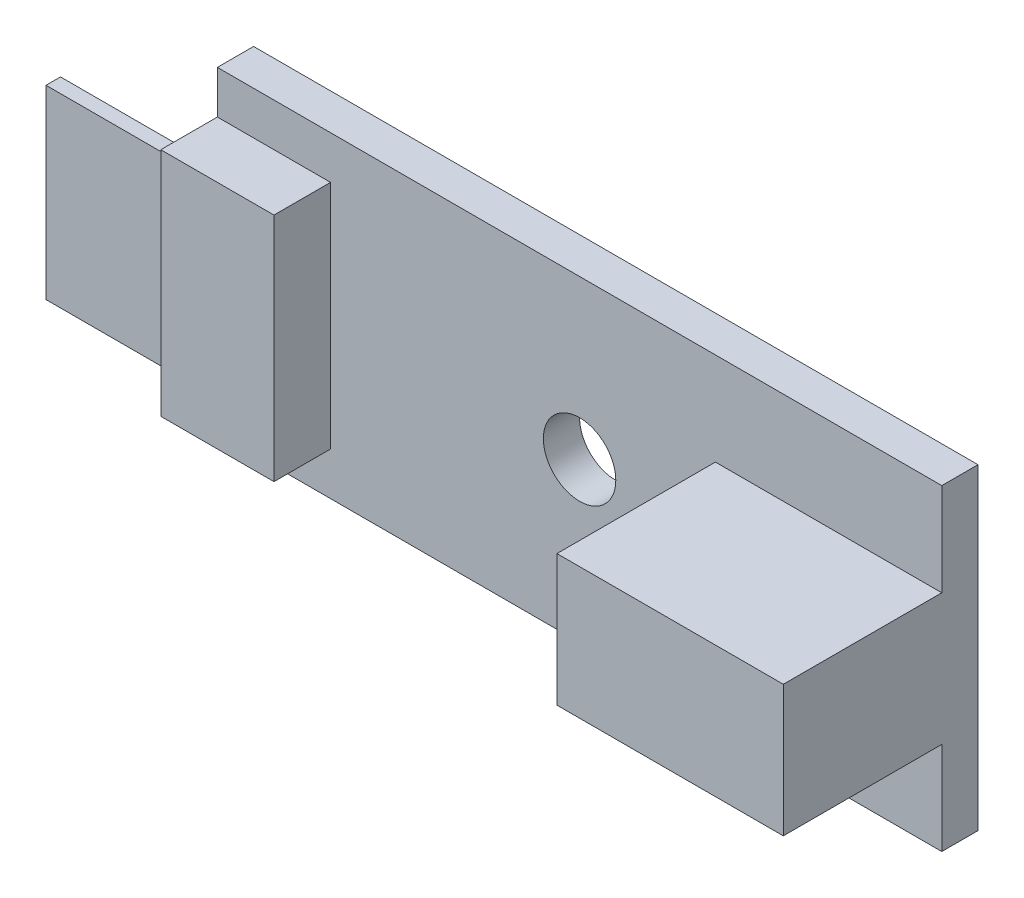
ISO-10303-21;
HEADER;
FILE_DESCRIPTION(('STEP AP214'),'2;1');
FILE_NAME('part.step','',(''),(''),'','','');
FILE_SCHEMA(('AUTOMOTIVE_DESIGN { 1 0 10303 214 1 1 1 1 }'));
ENDSEC;
DATA;
#1=APPLICATION_CONTEXT('core data for automotive mechanical design processes');
#2=APPLICATION_PROTOCOL_DEFINITION('international standard','automotive_design',2000,#1);
#3=PRODUCT_CONTEXT('',#1,'mechanical');
#4=PRODUCT('Part','Part','',(#3));
#5=PRODUCT_RELATED_PRODUCT_CATEGORY('part','',(#4));
#6=PRODUCT_DEFINITION_FORMATION('','',#4);
#7=PRODUCT_DEFINITION_CONTEXT('part definition',#1,'design');
#8=PRODUCT_DEFINITION('design','',#6,#7);
#9=PRODUCT_DEFINITION_SHAPE('','',#8);
#10=(LENGTH_UNIT() NAMED_UNIT(*) SI_UNIT(.MILLI.,.METRE.));
#11=(NAMED_UNIT(*) PLANE_ANGLE_UNIT() SI_UNIT($,.RADIAN.));
#12=(NAMED_UNIT(*) SI_UNIT($,.STERADIAN.) SOLID_ANGLE_UNIT());
#13=UNCERTAINTY_MEASURE_WITH_UNIT(LENGTH_MEASURE(1.E-05),#10,'distance_accuracy_value','');
#14=(GEOMETRIC_REPRESENTATION_CONTEXT(3) GLOBAL_UNCERTAINTY_ASSIGNED_CONTEXT((#13)) GLOBAL_UNIT_ASSIGNED_CONTEXT((#10,
#11,#12)) REPRESENTATION_CONTEXT('',''));
#15=CARTESIAN_POINT('',(0.,0.,0.));
#16=DIRECTION('',(0.,0.,1.));
#17=DIRECTION('',(1.,0.,0.));
#18=AXIS2_PLACEMENT_3D('',#15,#16,#17);
#19=CARTESIAN_POINT('',(6.,-2.9,7.));
#20=DIRECTION('',(0.,0.,1.));
#21=DIRECTION('',(1.,0.,0.));
#22=AXIS2_PLACEMENT_3D('',#19,#20,#21);
#23=PLANE('',#22);
#24=DIRECTION('',(0.,1.,0.));
#25=VECTOR('',#24,1.);
#26=CARTESIAN_POINT('',(6.,-2.9,7.));
#27=LINE('',#26,#25);
#28=CARTESIAN_POINT('',(6.,-2.9,7.));
#29=VERTEX_POINT('',#28);
#30=CARTESIAN_POINT('',(6.,2.9,7.));
#31=VERTEX_POINT('',#30);
#32=EDGE_CURVE('E135',#29,#31,#27,.T.);
#33=ORIENTED_EDGE('',*,*,#32,.F.);
#34=DIRECTION('',(1.,0.,0.));
#35=VECTOR('',#34,1.);
#36=CARTESIAN_POINT('',(6.,-2.9,7.));
#37=LINE('',#36,#35);
#38=CARTESIAN_POINT('',(16.,-2.9,7.));
#39=VERTEX_POINT('',#38);
#40=EDGE_CURVE('E11',#29,#39,#37,.T.);
#41=ORIENTED_EDGE('',*,*,#40,.T.);
#42=DIRECTION('',(0.,1.,0.));
#43=VECTOR('',#42,1.);
#44=CARTESIAN_POINT('',(16.,-2.9,7.));
#45=LINE('',#44,#43);
#46=CARTESIAN_POINT('',(16.,2.9,7.));
#47=VERTEX_POINT('',#46);
#48=EDGE_CURVE('E133',#39,#47,#45,.T.);
#49=ORIENTED_EDGE('',*,*,#48,.T.);
#50=DIRECTION('',(1.,0.,0.));
#51=VECTOR('',#50,1.);
#52=CARTESIAN_POINT('',(6.,2.9,7.));
#53=LINE('',#52,#51);
#54=EDGE_CURVE('E163',#31,#47,#53,.T.);
#55=ORIENTED_EDGE('',*,*,#54,.F.);
#56=EDGE_LOOP('',(#33,#41,#49,#55));
#57=FACE_BOUND('',#56,.T.);
#58=ADVANCED_FACE('F17',(#57),#23,.T.);
#59=CARTESIAN_POINT('',(-22.,-4.1,0.93));
#60=DIRECTION('',(1.,0.,0.));
#61=DIRECTION('',(0.,1.,0.));
#62=AXIS2_PLACEMENT_3D('',#59,#60,#61);
#63=PLANE('',#62);
#64=DIRECTION('',(0.,1.,0.));
#65=VECTOR('',#64,1.);
#66=CARTESIAN_POINT('',(-22.,-4.1,1.57));
#67=LINE('',#66,#65);
#68=CARTESIAN_POINT('',(-22.,-4.1,1.57));
#69=VERTEX_POINT('',#68);
#70=CARTESIAN_POINT('',(-22.,4.1,1.57));
#71=VERTEX_POINT('',#70);
#72=EDGE_CURVE('E155',#69,#71,#67,.T.);
#73=ORIENTED_EDGE('',*,*,#72,.T.);
#74=DIRECTION('',(0.,0.,1.));
#75=VECTOR('',#74,1.);
#76=CARTESIAN_POINT('',(-22.,4.1,0.93));
#77=LINE('',#76,#75);
#78=CARTESIAN_POINT('',(-22.,4.1,0.93));
#79=VERTEX_POINT('',#78);
#80=EDGE_CURVE('E240',#79,#71,#77,.T.);
#81=ORIENTED_EDGE('',*,*,#80,.F.);
#82=DIRECTION('',(0.,1.,0.));
#83=VECTOR('',#82,1.);
#84=CARTESIAN_POINT('',(-22.,-4.1,0.93));
#85=LINE('',#84,#83);
#86=CARTESIAN_POINT('',(-22.,-4.1,0.93));
#87=VERTEX_POINT('',#86);
#88=EDGE_CURVE('E244',#87,#79,#85,.T.);
#89=ORIENTED_EDGE('',*,*,#88,.F.);
#90=DIRECTION('',(0.,0.,1.));
#91=VECTOR('',#90,1.);
#92=CARTESIAN_POINT('',(-22.,-4.1,0.93));
#93=LINE('',#92,#91);
#94=EDGE_CURVE('E232',#87,#69,#93,.T.);
#95=ORIENTED_EDGE('',*,*,#94,.T.);
#96=EDGE_LOOP('',(#73,#81,#89,#95));
#97=FACE_BOUND('',#96,.T.);
#98=ADVANCED_FACE('F254',(#97),#63,.F.);
#99=CARTESIAN_POINT('',(0.,0.,-2.4));
#100=DIRECTION('',(0.,0.,1.));
#101=DIRECTION('',(1.,0.,0.));
#102=AXIS2_PLACEMENT_3D('',#99,#100,#101);
#103=CYLINDRICAL_SURFACE('',#102,1.6);
#104=CARTESIAN_POINT('',(0.,0.,0.));
#105=DIRECTION('',(0.,0.,1.));
#106=DIRECTION('',(1.,0.,0.));
#107=AXIS2_PLACEMENT_3D('',#104,#105,#106);
#108=CIRCLE('',#107,1.6);
#109=CARTESIAN_POINT('',(1.6,0.,0.));
#110=VERTEX_POINT('',#109);
#111=EDGE_CURVE('E194',#110,#110,#108,.T.);
#112=ORIENTED_EDGE('',*,*,#111,.T.);
#113=EDGE_LOOP('',(#112));
#114=FACE_BOUND('',#113,.T.);
#115=CARTESIAN_POINT('',(0.,0.,-1.6));
#116=DIRECTION('',(0.,0.,1.));
#117=DIRECTION('',(1.,0.,0.));
#118=AXIS2_PLACEMENT_3D('',#115,#116,#117);
#119=CIRCLE('',#118,1.6);
#120=CARTESIAN_POINT('',(1.6,0.,-1.6));
#121=VERTEX_POINT('',#120);
#122=EDGE_CURVE('E206',#121,#121,#119,.T.);
#123=ORIENTED_EDGE('',*,*,#122,.F.);
#124=EDGE_LOOP('',(#123));
#125=FACE_BOUND('',#124,.T.);
#126=ADVANCED_FACE('F409',(#114,#125),#103,.F.);
#127=CARTESIAN_POINT('',(-11.,-5.1,0.));
#128=DIRECTION('',(1.,0.,0.));
#129=DIRECTION('',(0.,1.,0.));
#130=AXIS2_PLACEMENT_3D('',#127,#128,#129);
#131=PLANE('',#130);
#132=DIRECTION('',(0.,0.,1.));
#133=VECTOR('',#132,1.);
#134=CARTESIAN_POINT('',(-11.,-5.1,0.));
#135=LINE('',#134,#133);
#136=CARTESIAN_POINT('',(-11.,-5.1,0.));
#137=VERTEX_POINT('',#136);
#138=CARTESIAN_POINT('',(-11.,-5.1,2.5));
#139=VERTEX_POINT('',#138);
#140=EDGE_CURVE('E210',#137,#139,#135,.T.);
#141=ORIENTED_EDGE('',*,*,#140,.F.);
#142=DIRECTION('',(0.,1.,0.));
#143=VECTOR('',#142,1.);
#144=CARTESIAN_POINT('',(-11.,-5.1,0.));
#145=LINE('',#144,#143);
#146=CARTESIAN_POINT('',(-11.,5.1,0.));
#147=VERTEX_POINT('',#146);
#148=EDGE_CURVE('E278',#137,#147,#145,.T.);
#149=ORIENTED_EDGE('',*,*,#148,.T.);
#150=DIRECTION('',(0.,0.,1.));
#151=VECTOR('',#150,1.);
#152=CARTESIAN_POINT('',(-11.,5.1,0.));
#153=LINE('',#152,#151);
#154=CARTESIAN_POINT('',(-11.,5.1,2.5));
#155=VERTEX_POINT('',#154);
#156=EDGE_CURVE('E226',#147,#155,#153,.T.);
#157=ORIENTED_EDGE('',*,*,#156,.T.);
#158=DIRECTION('',(0.,1.,0.));
#159=VECTOR('',#158,1.);
#160=CARTESIAN_POINT('',(-11.,-5.1,2.5));
#161=LINE('',#160,#159);
#162=EDGE_CURVE('E221',#139,#155,#161,.T.);
#163=ORIENTED_EDGE('',*,*,#162,.F.);
#164=EDGE_LOOP('',(#141,#149,#157,#163));
#165=FACE_BOUND('',#164,.T.);
#166=ADVANCED_FACE('F416',(#165),#131,.T.);
#167=CARTESIAN_POINT('',(6.,-2.9,0.));
#168=DIRECTION('',(0.,1.,0.));
#169=DIRECTION('',(1.,0.,0.));
#170=AXIS2_PLACEMENT_3D('',#167,#168,#169);
#171=PLANE('',#170);
#172=DIRECTION('',(0.,0.,1.));
#173=VECTOR('',#172,1.);
#174=CARTESIAN_POINT('',(16.,-2.9,0.));
#175=LINE('',#174,#173);
#176=CARTESIAN_POINT('',(16.,-2.9,0.));
#177=VERTEX_POINT('',#176);
#178=EDGE_CURVE('E137',#177,#39,#175,.T.);
#179=ORIENTED_EDGE('',*,*,#178,.T.);
#180=ORIENTED_EDGE('',*,*,#40,.F.);
#181=DIRECTION('',(0.,0.,1.));
#182=VECTOR('',#181,1.);
#183=CARTESIAN_POINT('',(6.,-2.9,0.));
#184=LINE('',#183,#182);
#185=CARTESIAN_POINT('',(6.,-2.9,0.));
#186=VERTEX_POINT('',#185);
#187=EDGE_CURVE('E26',#186,#29,#184,.T.);
#188=ORIENTED_EDGE('',*,*,#187,.F.);
#189=DIRECTION('',(1.,0.,0.));
#190=VECTOR('',#189,1.);
#191=CARTESIAN_POINT('',(6.,-2.9,0.));
#192=LINE('',#191,#190);
#193=EDGE_CURVE('E140',#186,#177,#192,.T.);
#194=ORIENTED_EDGE('',*,*,#193,.T.);
#195=EDGE_LOOP('',(#179,#180,#188,#194));
#196=FACE_BOUND('',#195,.T.);
#197=ADVANCED_FACE('F138',(#196),#171,.F.);
#198=CARTESIAN_POINT('',(6.,-2.9,0.));
#199=DIRECTION('',(1.,0.,0.));
#200=DIRECTION('',(0.,1.,0.));
#201=AXIS2_PLACEMENT_3D('',#198,#199,#200);
#202=PLANE('',#201);
#203=ORIENTED_EDGE('',*,*,#32,.T.);
#204=DIRECTION('',(0.,0.,1.));
#205=VECTOR('',#204,1.);
#206=CARTESIAN_POINT('',(6.,2.9,0.));
#207=LINE('',#206,#205);
#208=CARTESIAN_POINT('',(6.,2.9,0.));
#209=VERTEX_POINT('',#208);
#210=EDGE_CURVE('E144',#209,#31,#207,.T.);
#211=ORIENTED_EDGE('',*,*,#210,.F.);
#212=DIRECTION('',(0.,1.,0.));
#213=VECTOR('',#212,1.);
#214=CARTESIAN_POINT('',(6.,-2.9,0.));
#215=LINE('',#214,#213);
#216=EDGE_CURVE('E173',#186,#209,#215,.T.);
#217=ORIENTED_EDGE('',*,*,#216,.F.);
#218=ORIENTED_EDGE('',*,*,#187,.T.);
#219=EDGE_LOOP('',(#203,#211,#217,#218));
#220=FACE_BOUND('',#219,.T.);
#221=ADVANCED_FACE('F171',(#220),#202,.F.);
#222=CARTESIAN_POINT('',(6.,2.9,0.));
#223=DIRECTION('',(0.,1.,0.));
#224=DIRECTION('',(1.,0.,0.));
#225=AXIS2_PLACEMENT_3D('',#222,#223,#224);
#226=PLANE('',#225);
#227=DIRECTION('',(1.,0.,0.));
#228=VECTOR('',#227,1.);
#229=CARTESIAN_POINT('',(6.,2.9,0.));
#230=LINE('',#229,#228);
#231=CARTESIAN_POINT('',(16.,2.9,0.));
#232=VERTEX_POINT('',#231);
#233=EDGE_CURVE('E178',#209,#232,#230,.T.);
#234=ORIENTED_EDGE('',*,*,#233,.F.);
#235=ORIENTED_EDGE('',*,*,#210,.T.);
#236=ORIENTED_EDGE('',*,*,#54,.T.);
#237=DIRECTION('',(0.,0.,1.));
#238=VECTOR('',#237,1.);
#239=CARTESIAN_POINT('',(16.,2.9,0.));
#240=LINE('',#239,#238);
#241=EDGE_CURVE('E149',#232,#47,#240,.T.);
#242=ORIENTED_EDGE('',*,*,#241,.F.);
#243=EDGE_LOOP('',(#234,#235,#236,#242));
#244=FACE_BOUND('',#243,.T.);
#245=ADVANCED_FACE('F434',(#244),#226,.T.);
#246=CARTESIAN_POINT('',(16.,-7.,-1.6));
#247=DIRECTION('',(1.,0.,0.));
#248=DIRECTION('',(0.,1.,0.));
#249=AXIS2_PLACEMENT_3D('',#246,#247,#248);
#250=PLANE('',#249);
#251=DIRECTION('',(0.,0.,1.));
#252=VECTOR('',#251,1.);
#253=CARTESIAN_POINT('',(16.,-7.,-1.6));
#254=LINE('',#253,#252);
#255=CARTESIAN_POINT('',(16.,-7.,-1.6));
#256=VERTEX_POINT('',#255);
#257=CARTESIAN_POINT('',(16.,-7.,0.));
#258=VERTEX_POINT('',#257);
#259=EDGE_CURVE('E297',#256,#258,#254,.T.);
#260=ORIENTED_EDGE('',*,*,#259,.F.);
#261=DIRECTION('',(0.,1.,0.));
#262=VECTOR('',#261,1.);
#263=CARTESIAN_POINT('',(16.,-7.,-1.6));
#264=LINE('',#263,#262);
#265=CARTESIAN_POINT('',(16.,7.,-1.6));
#266=VERTEX_POINT('',#265);
#267=EDGE_CURVE('E201',#256,#266,#264,.T.);
#268=ORIENTED_EDGE('',*,*,#267,.T.);
#269=DIRECTION('',(0.,0.,1.));
#270=VECTOR('',#269,1.);
#271=CARTESIAN_POINT('',(16.,7.,-1.6));
#272=LINE('',#271,#270);
#273=CARTESIAN_POINT('',(16.,7.,0.));
#274=VERTEX_POINT('',#273);
#275=EDGE_CURVE('E218',#266,#274,#272,.T.);
#276=ORIENTED_EDGE('',*,*,#275,.T.);
#277=DIRECTION('',(0.,1.,0.));
#278=VECTOR('',#277,1.);
#279=CARTESIAN_POINT('',(16.,-7.,0.));
#280=LINE('',#279,#278);
#281=EDGE_CURVE('E293',#232,#274,#280,.T.);
#282=ORIENTED_EDGE('',*,*,#281,.F.);
#283=ORIENTED_EDGE('',*,*,#241,.T.);
#284=ORIENTED_EDGE('',*,*,#48,.F.);
#285=ORIENTED_EDGE('',*,*,#178,.F.);
#286=DIRECTION('',(0.,1.,0.));
#287=VECTOR('',#286,1.);
#288=CARTESIAN_POINT('',(16.,-7.,0.));
#289=LINE('',#288,#287);
#290=EDGE_CURVE('E183',#258,#177,#289,.T.);
#291=ORIENTED_EDGE('',*,*,#290,.F.);
#292=EDGE_LOOP('',(#260,#268,#276,#282,#283,#284,#285,#291));
#293=FACE_BOUND('',#292,.T.);
#294=ADVANCED_FACE('F147',(#293),#250,.T.);
#295=CARTESIAN_POINT('',(-22.,-4.1,1.57));
#296=DIRECTION('',(0.,0.,1.));
#297=DIRECTION('',(1.,0.,0.));
#298=AXIS2_PLACEMENT_3D('',#295,#296,#297);
#299=PLANE('',#298);
#300=ORIENTED_EDGE('',*,*,#72,.F.);
#301=DIRECTION('',(1.,0.,0.));
#302=VECTOR('',#301,1.);
#303=CARTESIAN_POINT('',(-22.,-4.1,1.57));
#304=LINE('',#303,#302);
#305=CARTESIAN_POINT('',(-16.,-4.1,1.57));
#306=VERTEX_POINT('',#305);
#307=EDGE_CURVE('E229',#69,#306,#304,.T.);
#308=ORIENTED_EDGE('',*,*,#307,.T.);
#309=DIRECTION('',(0.,1.,0.));
#310=VECTOR('',#309,1.);
#311=CARTESIAN_POINT('',(-16.,-4.1,1.57));
#312=LINE('',#311,#310);
#313=CARTESIAN_POINT('',(-16.,4.1,1.57));
#314=VERTEX_POINT('',#313);
#315=EDGE_CURVE('E261',#306,#314,#312,.T.);
#316=ORIENTED_EDGE('',*,*,#315,.T.);
#317=DIRECTION('',(1.,0.,0.));
#318=VECTOR('',#317,1.);
#319=CARTESIAN_POINT('',(-22.,4.1,1.57));
#320=LINE('',#319,#318);
#321=EDGE_CURVE('E243',#71,#314,#320,.T.);
#322=ORIENTED_EDGE('',*,*,#321,.F.);
#323=EDGE_LOOP('',(#300,#308,#316,#322));
#324=FACE_BOUND('',#323,.T.);
#325=ADVANCED_FACE('F259',(#324),#299,.T.);
#326=CARTESIAN_POINT('',(-22.,4.1,0.93));
#327=DIRECTION('',(0.,1.,0.));
#328=DIRECTION('',(1.,0.,0.));
#329=AXIS2_PLACEMENT_3D('',#326,#327,#328);
#330=PLANE('',#329);
#331=DIRECTION('',(1.,0.,0.));
#332=VECTOR('',#331,1.);
#333=CARTESIAN_POINT('',(-22.,4.1,0.93));
#334=LINE('',#333,#332);
#335=CARTESIAN_POINT('',(-16.,4.1,0.93));
#336=VERTEX_POINT('',#335);
#337=EDGE_CURVE('E239',#79,#336,#334,.T.);
#338=ORIENTED_EDGE('',*,*,#337,.F.);
#339=ORIENTED_EDGE('',*,*,#80,.T.);
#340=ORIENTED_EDGE('',*,*,#321,.T.);
#341=DIRECTION('',(0.,0.,1.));
#342=VECTOR('',#341,1.);
#343=CARTESIAN_POINT('',(-16.,4.1,0.93));
#344=LINE('',#343,#342);
#345=EDGE_CURVE('E266',#336,#314,#344,.T.);
#346=ORIENTED_EDGE('',*,*,#345,.F.);
#347=EDGE_LOOP('',(#338,#339,#340,#346));
#348=FACE_BOUND('',#347,.T.);
#349=ADVANCED_FACE('F264',(#348),#330,.T.);
#350=CARTESIAN_POINT('',(-22.,-4.1,0.93));
#351=DIRECTION('',(0.,0.,1.));
#352=DIRECTION('',(1.,0.,0.));
#353=AXIS2_PLACEMENT_3D('',#350,#351,#352);
#354=PLANE('',#353);
#355=ORIENTED_EDGE('',*,*,#337,.T.);
#356=DIRECTION('',(0.,1.,0.));
#357=VECTOR('',#356,1.);
#358=CARTESIAN_POINT('',(-16.,-4.1,0.93));
#359=LINE('',#358,#357);
#360=CARTESIAN_POINT('',(-16.,-4.1,0.93));
#361=VERTEX_POINT('',#360);
#362=EDGE_CURVE('E310',#361,#336,#359,.T.);
#363=ORIENTED_EDGE('',*,*,#362,.F.);
#364=DIRECTION('',(1.,0.,0.));
#365=VECTOR('',#364,1.);
#366=CARTESIAN_POINT('',(-22.,-4.1,0.93));
#367=LINE('',#366,#365);
#368=EDGE_CURVE('E236',#87,#361,#367,.T.);
#369=ORIENTED_EDGE('',*,*,#368,.F.);
#370=ORIENTED_EDGE('',*,*,#88,.T.);
#371=EDGE_LOOP('',(#355,#363,#369,#370));
#372=FACE_BOUND('',#371,.T.);
#373=ADVANCED_FACE('F458',(#372),#354,.F.);
#374=CARTESIAN_POINT('',(-22.,-4.1,0.93));
#375=DIRECTION('',(0.,1.,0.));
#376=DIRECTION('',(1.,0.,0.));
#377=AXIS2_PLACEMENT_3D('',#374,#375,#376);
#378=PLANE('',#377);
#379=DIRECTION('',(0.,0.,1.));
#380=VECTOR('',#379,1.);
#381=CARTESIAN_POINT('',(-16.,-4.1,0.93));
#382=LINE('',#381,#380);
#383=EDGE_CURVE('E302',#361,#306,#382,.T.);
#384=ORIENTED_EDGE('',*,*,#383,.T.);
#385=ORIENTED_EDGE('',*,*,#307,.F.);
#386=ORIENTED_EDGE('',*,*,#94,.F.);
#387=ORIENTED_EDGE('',*,*,#368,.T.);
#388=EDGE_LOOP('',(#384,#385,#386,#387));
#389=FACE_BOUND('',#388,.T.);
#390=ADVANCED_FACE('F466',(#389),#378,.F.);
#391=CARTESIAN_POINT('',(-16.,5.1,0.));
#392=DIRECTION('',(0.,1.,0.));
#393=DIRECTION('',(1.,0.,0.));
#394=AXIS2_PLACEMENT_3D('',#391,#392,#393);
#395=PLANE('',#394);
#396=DIRECTION('',(1.,0.,0.));
#397=VECTOR('',#396,1.);
#398=CARTESIAN_POINT('',(-16.,5.1,0.));
#399=LINE('',#398,#397);
#400=CARTESIAN_POINT('',(-16.,5.1,0.));
#401=VERTEX_POINT('',#400);
#402=EDGE_CURVE('E285',#401,#147,#399,.T.);
#403=ORIENTED_EDGE('',*,*,#402,.F.);
#404=DIRECTION('',(0.,0.,1.));
#405=VECTOR('',#404,1.);
#406=CARTESIAN_POINT('',(-16.,5.1,0.));
#407=LINE('',#406,#405);
#408=CARTESIAN_POINT('',(-16.,5.1,2.5));
#409=VERTEX_POINT('',#408);
#410=EDGE_CURVE('E324',#401,#409,#407,.T.);
#411=ORIENTED_EDGE('',*,*,#410,.T.);
#412=DIRECTION('',(1.,0.,0.));
#413=VECTOR('',#412,1.);
#414=CARTESIAN_POINT('',(-16.,5.1,2.5));
#415=LINE('',#414,#413);
#416=EDGE_CURVE('E222',#409,#155,#415,.T.);
#417=ORIENTED_EDGE('',*,*,#416,.T.);
#418=ORIENTED_EDGE('',*,*,#156,.F.);
#419=EDGE_LOOP('',(#403,#411,#417,#418));
#420=FACE_BOUND('',#419,.T.);
#421=ADVANCED_FACE('F477',(#420),#395,.T.);
#422=CARTESIAN_POINT('',(-16.,-5.1,2.5));
#423=DIRECTION('',(0.,0.,1.));
#424=DIRECTION('',(1.,0.,0.));
#425=AXIS2_PLACEMENT_3D('',#422,#423,#424);
#426=PLANE('',#425);
#427=DIRECTION('',(0.,1.,0.));
#428=VECTOR('',#427,1.);
#429=CARTESIAN_POINT('',(-16.,-5.1,2.5));
#430=LINE('',#429,#428);
#431=CARTESIAN_POINT('',(-16.,-5.1,2.5));
#432=VERTEX_POINT('',#431);
#433=EDGE_CURVE('E328',#432,#409,#430,.T.);
#434=ORIENTED_EDGE('',*,*,#433,.F.);
#435=DIRECTION('',(1.,0.,0.));
#436=VECTOR('',#435,1.);
#437=CARTESIAN_POINT('',(-16.,-5.1,2.5));
#438=LINE('',#437,#436);
#439=EDGE_CURVE('E214',#432,#139,#438,.T.);
#440=ORIENTED_EDGE('',*,*,#439,.T.);
#441=ORIENTED_EDGE('',*,*,#162,.T.);
#442=ORIENTED_EDGE('',*,*,#416,.F.);
#443=EDGE_LOOP('',(#434,#440,#441,#442));
#444=FACE_BOUND('',#443,.T.);
#445=ADVANCED_FACE('F471',(#444),#426,.T.);
#446=CARTESIAN_POINT('',(-16.,7.,-1.6));
#447=DIRECTION('',(0.,1.,0.));
#448=DIRECTION('',(1.,0.,0.));
#449=AXIS2_PLACEMENT_3D('',#446,#447,#448);
#450=PLANE('',#449);
#451=DIRECTION('',(1.,0.,0.));
#452=VECTOR('',#451,1.);
#453=CARTESIAN_POINT('',(-16.,7.,-1.6));
#454=LINE('',#453,#452);
#455=CARTESIAN_POINT('',(-16.,7.,-1.6));
#456=VERTEX_POINT('',#455);
#457=EDGE_CURVE('E198',#456,#266,#454,.T.);
#458=ORIENTED_EDGE('',*,*,#457,.F.);
#459=DIRECTION('',(0.,0.,1.));
#460=VECTOR('',#459,1.);
#461=CARTESIAN_POINT('',(-16.,7.,-1.6));
#462=LINE('',#461,#460);
#463=CARTESIAN_POINT('',(-16.,7.,0.));
#464=VERTEX_POINT('',#463);
#465=EDGE_CURVE('E323',#456,#464,#462,.T.);
#466=ORIENTED_EDGE('',*,*,#465,.T.);
#467=DIRECTION('',(1.,0.,0.));
#468=VECTOR('',#467,1.);
#469=CARTESIAN_POINT('',(-16.,7.,0.));
#470=LINE('',#469,#468);
#471=EDGE_CURVE('E289',#464,#274,#470,.T.);
#472=ORIENTED_EDGE('',*,*,#471,.T.);
#473=ORIENTED_EDGE('',*,*,#275,.F.);
#474=EDGE_LOOP('',(#458,#466,#472,#473));
#475=FACE_BOUND('',#474,.T.);
#476=ADVANCED_FACE('F476',(#475),#450,.T.);
#477=CARTESIAN_POINT('',(-16.,-5.1,0.));
#478=DIRECTION('',(0.,1.,0.));
#479=DIRECTION('',(1.,0.,0.));
#480=AXIS2_PLACEMENT_3D('',#477,#478,#479);
#481=PLANE('',#480);
#482=ORIENTED_EDGE('',*,*,#140,.T.);
#483=ORIENTED_EDGE('',*,*,#439,.F.);
#484=DIRECTION('',(0.,0.,1.));
#485=VECTOR('',#484,1.);
#486=CARTESIAN_POINT('',(-16.,-5.1,0.));
#487=LINE('',#486,#485);
#488=CARTESIAN_POINT('',(-16.,-5.1,0.));
#489=VERTEX_POINT('',#488);
#490=EDGE_CURVE('E336',#489,#432,#487,.T.);
#491=ORIENTED_EDGE('',*,*,#490,.F.);
#492=DIRECTION('',(1.,0.,0.));
#493=VECTOR('',#492,1.);
#494=CARTESIAN_POINT('',(-16.,-5.1,0.));
#495=LINE('',#494,#493);
#496=EDGE_CURVE('E188',#489,#137,#495,.T.);
#497=ORIENTED_EDGE('',*,*,#496,.T.);
#498=EDGE_LOOP('',(#482,#483,#491,#497));
#499=FACE_BOUND('',#498,.T.);
#500=ADVANCED_FACE('F370',(#499),#481,.F.);
#501=CARTESIAN_POINT('',(-16.,-7.,-1.6));
#502=DIRECTION('',(0.,0.,1.));
#503=DIRECTION('',(1.,0.,0.));
#504=AXIS2_PLACEMENT_3D('',#501,#502,#503);
#505=PLANE('',#504);
#506=ORIENTED_EDGE('',*,*,#122,.T.);
#507=EDGE_LOOP('',(#506));
#508=FACE_BOUND('',#507,.T.);
#509=ORIENTED_EDGE('',*,*,#457,.T.);
#510=ORIENTED_EDGE('',*,*,#267,.F.);
#511=DIRECTION('',(1.,0.,0.));
#512=VECTOR('',#511,1.);
#513=CARTESIAN_POINT('',(-16.,-7.,-1.6));
#514=LINE('',#513,#512);
#515=CARTESIAN_POINT('',(-16.,-7.,-1.6));
#516=VERTEX_POINT('',#515);
#517=EDGE_CURVE('E296',#516,#256,#514,.T.);
#518=ORIENTED_EDGE('',*,*,#517,.F.);
#519=DIRECTION('',(0.,1.,0.));
#520=VECTOR('',#519,1.);
#521=CARTESIAN_POINT('',(-16.,-7.,-1.6));
#522=LINE('',#521,#520);
#523=EDGE_CURVE('E332',#516,#456,#522,.T.);
#524=ORIENTED_EDGE('',*,*,#523,.T.);
#525=EDGE_LOOP('',(#509,#510,#518,#524));
#526=FACE_BOUND('',#525,.T.);
#527=ADVANCED_FACE('F488',(#508,#526),#505,.F.);
#528=CARTESIAN_POINT('',(-16.,-7.,0.));
#529=DIRECTION('',(0.,0.,1.));
#530=DIRECTION('',(1.,0.,0.));
#531=AXIS2_PLACEMENT_3D('',#528,#529,#530);
#532=PLANE('',#531);
#533=ORIENTED_EDGE('',*,*,#111,.F.);
#534=EDGE_LOOP('',(#533));
#535=FACE_BOUND('',#534,.T.);
#536=ORIENTED_EDGE('',*,*,#281,.T.);
#537=ORIENTED_EDGE('',*,*,#471,.F.);
#538=DIRECTION('',(0.,1.,0.));
#539=VECTOR('',#538,1.);
#540=CARTESIAN_POINT('',(-16.,-7.,0.));
#541=LINE('',#540,#539);
#542=EDGE_CURVE('E319',#401,#464,#541,.T.);
#543=ORIENTED_EDGE('',*,*,#542,.F.);
#544=ORIENTED_EDGE('',*,*,#402,.T.);
#545=ORIENTED_EDGE('',*,*,#148,.F.);
#546=ORIENTED_EDGE('',*,*,#496,.F.);
#547=DIRECTION('',(0.,1.,0.));
#548=VECTOR('',#547,1.);
#549=CARTESIAN_POINT('',(-16.,-7.,0.));
#550=LINE('',#549,#548);
#551=CARTESIAN_POINT('',(-16.,-7.,0.));
#552=VERTEX_POINT('',#551);
#553=EDGE_CURVE('E343',#552,#489,#550,.T.);
#554=ORIENTED_EDGE('',*,*,#553,.F.);
#555=DIRECTION('',(1.,0.,0.));
#556=VECTOR('',#555,1.);
#557=CARTESIAN_POINT('',(-16.,-7.,0.));
#558=LINE('',#557,#556);
#559=EDGE_CURVE('E301',#552,#258,#558,.T.);
#560=ORIENTED_EDGE('',*,*,#559,.T.);
#561=ORIENTED_EDGE('',*,*,#290,.T.);
#562=ORIENTED_EDGE('',*,*,#193,.F.);
#563=ORIENTED_EDGE('',*,*,#216,.T.);
#564=ORIENTED_EDGE('',*,*,#233,.T.);
#565=EDGE_LOOP('',(#536,#537,#543,#544,#545,#546,#554,#560,#561,#562,#563,#564));
#566=FACE_BOUND('',#565,.T.);
#567=ADVANCED_FACE('F181',(#535,#566),#532,.T.);
#568=CARTESIAN_POINT('',(-16.,-7.,-1.6));
#569=DIRECTION('',(0.,1.,0.));
#570=DIRECTION('',(1.,0.,0.));
#571=AXIS2_PLACEMENT_3D('',#568,#569,#570);
#572=PLANE('',#571);
#573=ORIENTED_EDGE('',*,*,#259,.T.);
#574=ORIENTED_EDGE('',*,*,#559,.F.);
#575=DIRECTION('',(0.,0.,1.));
#576=VECTOR('',#575,1.);
#577=CARTESIAN_POINT('',(-16.,-7.,-1.6));
#578=LINE('',#577,#576);
#579=EDGE_CURVE('E317',#516,#552,#578,.T.);
#580=ORIENTED_EDGE('',*,*,#579,.F.);
#581=ORIENTED_EDGE('',*,*,#517,.T.);
#582=EDGE_LOOP('',(#573,#574,#580,#581));
#583=FACE_BOUND('',#582,.T.);
#584=ADVANCED_FACE('F510',(#583),#572,.F.);
#585=CARTESIAN_POINT('',(-16.,-7.,-1.6));
#586=DIRECTION('',(1.,0.,0.));
#587=DIRECTION('',(0.,1.,0.));
#588=AXIS2_PLACEMENT_3D('',#585,#586,#587);
#589=PLANE('',#588);
#590=ORIENTED_EDGE('',*,*,#362,.T.);
#591=ORIENTED_EDGE('',*,*,#345,.T.);
#592=ORIENTED_EDGE('',*,*,#315,.F.);
#593=ORIENTED_EDGE('',*,*,#383,.F.);
#594=EDGE_LOOP('',(#590,#591,#592,#593));
#595=FACE_BOUND('',#594,.T.);
#596=ORIENTED_EDGE('',*,*,#553,.T.);
#597=ORIENTED_EDGE('',*,*,#490,.T.);
#598=ORIENTED_EDGE('',*,*,#433,.T.);
#599=ORIENTED_EDGE('',*,*,#410,.F.);
#600=ORIENTED_EDGE('',*,*,#542,.T.);
#601=ORIENTED_EDGE('',*,*,#465,.F.);
#602=ORIENTED_EDGE('',*,*,#523,.F.);
#603=ORIENTED_EDGE('',*,*,#579,.T.);
#604=EDGE_LOOP('',(#596,#597,#598,#599,#600,#601,#602,#603));
#605=FACE_BOUND('',#604,.T.);
#606=ADVANCED_FACE('F355',(#595,#605),#589,.F.);
#607=CLOSED_SHELL('',(#58,#98,#126,#166,#197,#221,#245,#294,#325,#349,#373,#390,#421,#445,#476,
#500,#527,#567,#584,#606));
#608=MANIFOLD_SOLID_BREP('B1',#607);
#609=ADVANCED_BREP_SHAPE_REPRESENTATION('',(#18,#608),#14);
#610=SHAPE_DEFINITION_REPRESENTATION(#9,#609);
ENDSEC;
END-ISO-10303-21;
